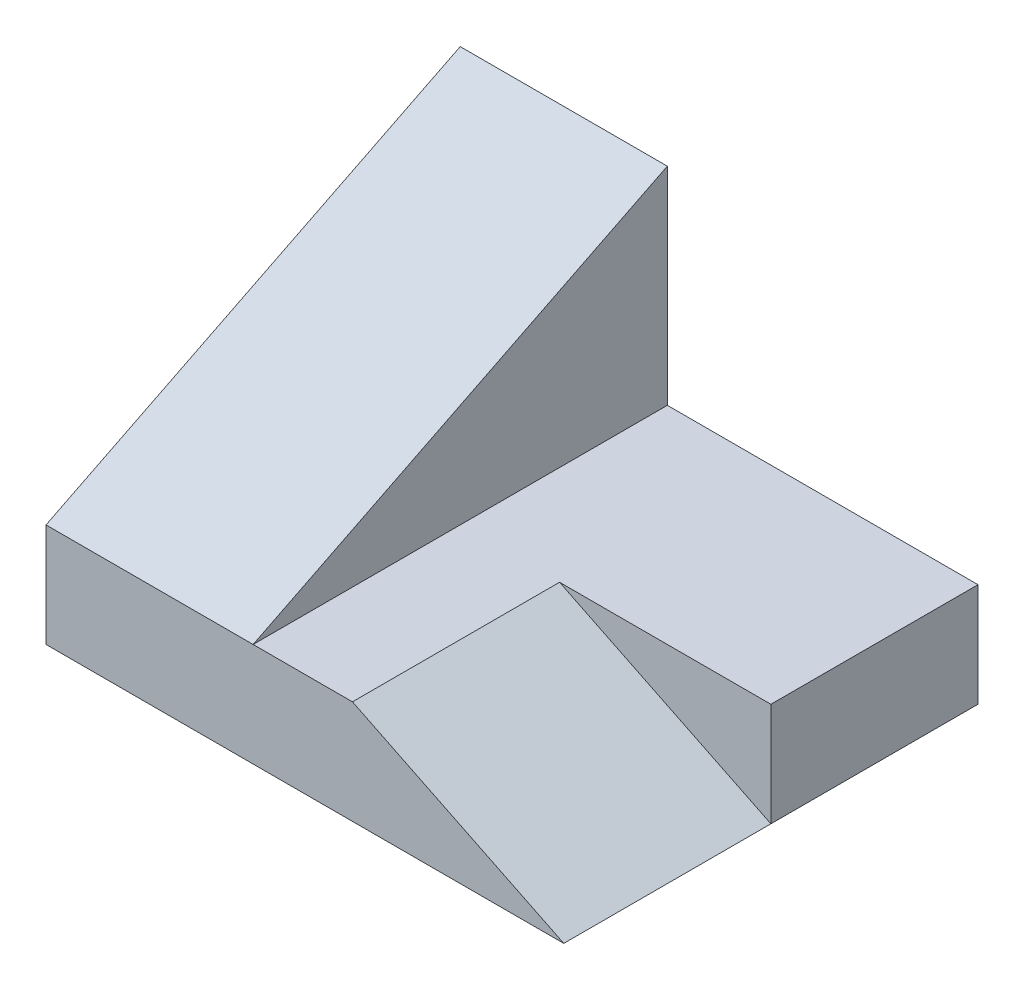
ISO-10303-21;
HEADER;
FILE_DESCRIPTION(('STEP AP214'),'2;1');
FILE_NAME('part.step','',(''),(''),'','','');
FILE_SCHEMA(('AUTOMOTIVE_DESIGN { 1 0 10303 214 1 1 1 1 }'));
ENDSEC;
DATA;
#1=APPLICATION_CONTEXT('core data for automotive mechanical design processes');
#2=APPLICATION_PROTOCOL_DEFINITION('international standard','automotive_design',2000,#1);
#3=PRODUCT_CONTEXT('',#1,'mechanical');
#4=PRODUCT('Part','Part','',(#3));
#5=PRODUCT_RELATED_PRODUCT_CATEGORY('part','',(#4));
#6=PRODUCT_DEFINITION_FORMATION('','',#4);
#7=PRODUCT_DEFINITION_CONTEXT('part definition',#1,'design');
#8=PRODUCT_DEFINITION('design','',#6,#7);
#9=PRODUCT_DEFINITION_SHAPE('','',#8);
#10=(LENGTH_UNIT() NAMED_UNIT(*) SI_UNIT(.MILLI.,.METRE.));
#11=(NAMED_UNIT(*) PLANE_ANGLE_UNIT() SI_UNIT($,.RADIAN.));
#12=(NAMED_UNIT(*) SI_UNIT($,.STERADIAN.) SOLID_ANGLE_UNIT());
#13=UNCERTAINTY_MEASURE_WITH_UNIT(LENGTH_MEASURE(1.E-05),#10,'distance_accuracy_value','');
#14=(GEOMETRIC_REPRESENTATION_CONTEXT(3) GLOBAL_UNCERTAINTY_ASSIGNED_CONTEXT((#13)) GLOBAL_UNIT_ASSIGNED_CONTEXT((#10,
#11,#12)) REPRESENTATION_CONTEXT('',''));
#15=CARTESIAN_POINT('',(0.,0.,0.));
#16=DIRECTION('',(0.,0.,1.));
#17=DIRECTION('',(1.,0.,0.));
#18=AXIS2_PLACEMENT_3D('',#15,#16,#17);
#19=CARTESIAN_POINT('',(0.,10.,0.));
#20=DIRECTION('',(0.,-1.,0.));
#21=DIRECTION('',(0.,0.,-1.));
#22=AXIS2_PLACEMENT_3D('',#19,#20,#21);
#23=PLANE('',#22);
#24=DIRECTION('',(0.,0.,-1.));
#25=VECTOR('',#24,1.);
#26=CARTESIAN_POINT('',(20.,10.,-40.));
#27=LINE('',#26,#25);
#28=CARTESIAN_POINT('',(20.,10.,0.));
#29=VERTEX_POINT('',#28);
#30=CARTESIAN_POINT('',(20.,10.,-40.));
#31=VERTEX_POINT('',#30);
#32=EDGE_CURVE('E164',#29,#31,#27,.T.);
#33=ORIENTED_EDGE('',*,*,#32,.F.);
#34=DIRECTION('',(1.,0.,0.));
#35=VECTOR('',#34,1.);
#36=CARTESIAN_POINT('',(0.,10.,0.));
#37=LINE('',#36,#35);
#38=CARTESIAN_POINT('',(29.5929197862648,10.,0.));
#39=VERTEX_POINT('',#38);
#40=EDGE_CURVE('E98',#29,#39,#37,.T.);
#41=ORIENTED_EDGE('',*,*,#40,.T.);
#42=DIRECTION('',(0.,0.,1.));
#43=VECTOR('',#42,1.);
#44=CARTESIAN_POINT('',(29.5929197862648,10.,-20.));
#45=LINE('',#44,#43);
#46=CARTESIAN_POINT('',(29.5929197862648,10.,-20.));
#47=VERTEX_POINT('',#46);
#48=EDGE_CURVE('E113',#47,#39,#45,.T.);
#49=ORIENTED_EDGE('',*,*,#48,.F.);
#50=DIRECTION('',(-1.,0.,0.));
#51=VECTOR('',#50,1.);
#52=CARTESIAN_POINT('',(50.,10.,-20.));
#53=LINE('',#52,#51);
#54=CARTESIAN_POINT('',(50.,10.,-20.));
#55=VERTEX_POINT('',#54);
#56=EDGE_CURVE('E133',#55,#47,#53,.T.);
#57=ORIENTED_EDGE('',*,*,#56,.F.);
#58=DIRECTION('',(0.,0.,-1.));
#59=VECTOR('',#58,1.);
#60=CARTESIAN_POINT('',(50.,10.,0.));
#61=LINE('',#60,#59);
#62=CARTESIAN_POINT('',(50.,10.,-40.));
#63=VERTEX_POINT('',#62);
#64=EDGE_CURVE('E55',#55,#63,#61,.T.);
#65=ORIENTED_EDGE('',*,*,#64,.T.);
#66=DIRECTION('',(-1.,0.,0.));
#67=VECTOR('',#66,1.);
#68=CARTESIAN_POINT('',(0.,10.,-40.));
#69=LINE('',#68,#67);
#70=EDGE_CURVE('E91',#63,#31,#69,.T.);
#71=ORIENTED_EDGE('',*,*,#70,.T.);
#72=EDGE_LOOP('',(#33,#41,#49,#57,#65,#71));
#73=FACE_BOUND('',#72,.T.);
#74=ADVANCED_FACE('F39',(#73),#23,.F.);
#75=CARTESIAN_POINT('',(50.,10.,0.));
#76=DIRECTION('',(-1.,0.,0.));
#77=DIRECTION('',(0.,0.,1.));
#78=AXIS2_PLACEMENT_3D('',#75,#76,#77);
#79=PLANE('',#78);
#80=DIRECTION('',(0.,1.,0.));
#81=VECTOR('',#80,1.);
#82=CARTESIAN_POINT('',(50.,0.,-20.));
#83=LINE('',#82,#81);
#84=CARTESIAN_POINT('',(50.,0.,-20.));
#85=VERTEX_POINT('',#84);
#86=EDGE_CURVE('E78',#85,#55,#83,.T.);
#87=ORIENTED_EDGE('',*,*,#86,.F.);
#88=DIRECTION('',(0.,0.,-1.));
#89=VECTOR('',#88,1.);
#90=CARTESIAN_POINT('',(50.,0.,0.));
#91=LINE('',#90,#89);
#92=CARTESIAN_POINT('',(50.,0.,-40.));
#93=VERTEX_POINT('',#92);
#94=EDGE_CURVE('E72',#85,#93,#91,.T.);
#95=ORIENTED_EDGE('',*,*,#94,.T.);
#96=DIRECTION('',(0.,-1.,0.));
#97=VECTOR('',#96,1.);
#98=CARTESIAN_POINT('',(50.,10.,-40.));
#99=LINE('',#98,#97);
#100=EDGE_CURVE('E48',#63,#93,#99,.T.);
#101=ORIENTED_EDGE('',*,*,#100,.F.);
#102=ORIENTED_EDGE('',*,*,#64,.F.);
#103=EDGE_LOOP('',(#87,#95,#101,#102));
#104=FACE_BOUND('',#103,.T.);
#105=ADVANCED_FACE('F74',(#104),#79,.F.);
#106=CARTESIAN_POINT('',(0.,10.,0.));
#107=DIRECTION('',(1.,0.,0.));
#108=DIRECTION('',(0.,0.,-1.));
#109=AXIS2_PLACEMENT_3D('',#106,#107,#108);
#110=PLANE('',#109);
#111=DIRECTION('',(0.,-1.,0.));
#112=VECTOR('',#111,1.);
#113=CARTESIAN_POINT('',(0.,10.,0.));
#114=LINE('',#113,#112);
#115=CARTESIAN_POINT('',(0.,10.,0.));
#116=VERTEX_POINT('',#115);
#117=CARTESIAN_POINT('',(0.,0.,0.));
#118=VERTEX_POINT('',#117);
#119=EDGE_CURVE('E11',#116,#118,#114,.T.);
#120=ORIENTED_EDGE('',*,*,#119,.F.);
#121=DIRECTION('',(0.,-0.447213595499958,0.894427190999916));
#122=VECTOR('',#121,1.);
#123=CARTESIAN_POINT('',(0.,10.,0.));
#124=LINE('',#123,#122);
#125=CARTESIAN_POINT('',(0.,30.,-40.));
#126=VERTEX_POINT('',#125);
#127=EDGE_CURVE('E163',#126,#116,#124,.T.);
#128=ORIENTED_EDGE('',*,*,#127,.F.);
#129=DIRECTION('',(0.,-1.,0.));
#130=VECTOR('',#129,1.);
#131=CARTESIAN_POINT('',(0.,10.,-40.));
#132=LINE('',#131,#130);
#133=CARTESIAN_POINT('',(0.,0.,-40.));
#134=VERTEX_POINT('',#133);
#135=EDGE_CURVE('E92',#126,#134,#132,.T.);
#136=ORIENTED_EDGE('',*,*,#135,.T.);
#137=DIRECTION('',(0.,0.,1.));
#138=VECTOR('',#137,1.);
#139=CARTESIAN_POINT('',(0.,0.,0.));
#140=LINE('',#139,#138);
#141=EDGE_CURVE('E97',#134,#118,#140,.T.);
#142=ORIENTED_EDGE('',*,*,#141,.T.);
#143=EDGE_LOOP('',(#120,#128,#136,#142));
#144=FACE_BOUND('',#143,.T.);
#145=ADVANCED_FACE('F41',(#144),#110,.F.);
#146=CARTESIAN_POINT('',(0.,10.,0.));
#147=DIRECTION('',(0.,0.,-1.));
#148=DIRECTION('',(-1.,0.,0.));
#149=AXIS2_PLACEMENT_3D('',#146,#147,#148);
#150=PLANE('',#149);
#151=ORIENTED_EDGE('',*,*,#40,.F.);
#152=DIRECTION('',(-1.,0.,0.));
#153=VECTOR('',#152,1.);
#154=CARTESIAN_POINT('',(20.,10.,0.));
#155=LINE('',#154,#153);
#156=EDGE_CURVE('E158',#29,#116,#155,.T.);
#157=ORIENTED_EDGE('',*,*,#156,.T.);
#158=ORIENTED_EDGE('',*,*,#119,.T.);
#159=DIRECTION('',(1.,0.,0.));
#160=VECTOR('',#159,1.);
#161=CARTESIAN_POINT('',(0.,0.,0.));
#162=LINE('',#161,#160);
#163=CARTESIAN_POINT('',(50.,0.,0.));
#164=VERTEX_POINT('',#163);
#165=EDGE_CURVE('E83',#118,#164,#162,.T.);
#166=ORIENTED_EDGE('',*,*,#165,.T.);
#167=DIRECTION('',(0.897981074159523,-0.440034078738579,0.));
#168=VECTOR('',#167,1.);
#169=CARTESIAN_POINT('',(29.5929197862648,10.,0.));
#170=LINE('',#169,#168);
#171=EDGE_CURVE('E119',#39,#164,#170,.T.);
#172=ORIENTED_EDGE('',*,*,#171,.F.);
#173=EDGE_LOOP('',(#151,#157,#158,#166,#172));
#174=FACE_BOUND('',#173,.T.);
#175=ADVANCED_FACE('F118',(#174),#150,.F.);
#176=CARTESIAN_POINT('',(0.,10.,-40.));
#177=DIRECTION('',(0.,0.,1.));
#178=DIRECTION('',(1.,0.,0.));
#179=AXIS2_PLACEMENT_3D('',#176,#177,#178);
#180=PLANE('',#179);
#181=DIRECTION('',(-1.,0.,0.));
#182=VECTOR('',#181,1.);
#183=CARTESIAN_POINT('',(0.,0.,-40.));
#184=LINE('',#183,#182);
#185=EDGE_CURVE('E88',#93,#134,#184,.T.);
#186=ORIENTED_EDGE('',*,*,#185,.T.);
#187=ORIENTED_EDGE('',*,*,#135,.F.);
#188=DIRECTION('',(-1.,0.,0.));
#189=VECTOR('',#188,1.);
#190=CARTESIAN_POINT('',(0.,30.,-40.));
#191=LINE('',#190,#189);
#192=CARTESIAN_POINT('',(20.,30.,-40.));
#193=VERTEX_POINT('',#192);
#194=EDGE_CURVE('E170',#193,#126,#191,.T.);
#195=ORIENTED_EDGE('',*,*,#194,.F.);
#196=DIRECTION('',(0.,-1.,0.));
#197=VECTOR('',#196,1.);
#198=CARTESIAN_POINT('',(20.,30.,-40.));
#199=LINE('',#198,#197);
#200=EDGE_CURVE('E137',#193,#31,#199,.T.);
#201=ORIENTED_EDGE('',*,*,#200,.T.);
#202=ORIENTED_EDGE('',*,*,#70,.F.);
#203=ORIENTED_EDGE('',*,*,#100,.T.);
#204=EDGE_LOOP('',(#186,#187,#195,#201,#202,#203));
#205=FACE_BOUND('',#204,.T.);
#206=ADVANCED_FACE('F86',(#205),#180,.F.);
#207=CARTESIAN_POINT('',(0.,0.,0.));
#208=DIRECTION('',(0.,-1.,0.));
#209=DIRECTION('',(0.,0.,-1.));
#210=AXIS2_PLACEMENT_3D('',#207,#208,#209);
#211=PLANE('',#210);
#212=ORIENTED_EDGE('',*,*,#141,.F.);
#213=ORIENTED_EDGE('',*,*,#185,.F.);
#214=ORIENTED_EDGE('',*,*,#94,.F.);
#215=EDGE_CURVE('E82',#164,#85,#91,.T.);
#216=ORIENTED_EDGE('',*,*,#215,.F.);
#217=ORIENTED_EDGE('',*,*,#165,.F.);
#218=EDGE_LOOP('',(#212,#213,#214,#216,#217));
#219=FACE_BOUND('',#218,.T.);
#220=ADVANCED_FACE('F94',(#219),#211,.T.);
#221=CARTESIAN_POINT('',(29.5929197862648,10.,-20.));
#222=DIRECTION('',(-0.440034078738579,-0.897981074159523,0.));
#223=DIRECTION('',(0.897981074159523,-0.440034078738579,0.));
#224=AXIS2_PLACEMENT_3D('',#221,#222,#223);
#225=PLANE('',#224);
#226=ORIENTED_EDGE('',*,*,#171,.T.);
#227=ORIENTED_EDGE('',*,*,#215,.T.);
#228=DIRECTION('',(0.897981074159523,-0.440034078738579,0.));
#229=VECTOR('',#228,1.);
#230=CARTESIAN_POINT('',(29.5929197862648,10.,-20.));
#231=LINE('',#230,#229);
#232=EDGE_CURVE('E127',#47,#85,#231,.T.);
#233=ORIENTED_EDGE('',*,*,#232,.F.);
#234=ORIENTED_EDGE('',*,*,#48,.T.);
#235=EDGE_LOOP('',(#226,#227,#233,#234));
#236=FACE_BOUND('',#235,.T.);
#237=ADVANCED_FACE('F125',(#236),#225,.F.);
#238=CARTESIAN_POINT('',(0.,0.,-20.));
#239=DIRECTION('',(0.,0.,1.));
#240=DIRECTION('',(1.,0.,0.));
#241=AXIS2_PLACEMENT_3D('',#238,#239,#240);
#242=PLANE('',#241);
#243=ORIENTED_EDGE('',*,*,#232,.T.);
#244=ORIENTED_EDGE('',*,*,#86,.T.);
#245=ORIENTED_EDGE('',*,*,#56,.T.);
#246=EDGE_LOOP('',(#243,#244,#245));
#247=FACE_BOUND('',#246,.T.);
#248=ADVANCED_FACE('F132',(#247),#242,.T.);
#249=CARTESIAN_POINT('',(20.,30.,-40.));
#250=DIRECTION('',(-1.,0.,0.));
#251=DIRECTION('',(0.,0.,1.));
#252=AXIS2_PLACEMENT_3D('',#249,#250,#251);
#253=PLANE('',#252);
#254=ORIENTED_EDGE('',*,*,#200,.F.);
#255=DIRECTION('',(0.,-0.447213595499958,0.894427190999916));
#256=VECTOR('',#255,1.);
#257=CARTESIAN_POINT('',(20.,10.,0.));
#258=LINE('',#257,#256);
#259=EDGE_CURVE('E161',#193,#29,#258,.T.);
#260=ORIENTED_EDGE('',*,*,#259,.T.);
#261=ORIENTED_EDGE('',*,*,#32,.T.);
#262=EDGE_LOOP('',(#254,#260,#261));
#263=FACE_BOUND('',#262,.T.);
#264=ADVANCED_FACE('F167',(#263),#253,.F.);
#265=CARTESIAN_POINT('',(20.,10.,0.));
#266=DIRECTION('',(0.,-0.894427190999916,-0.447213595499958));
#267=DIRECTION('',(0.,0.447213595499958,-0.894427190999916));
#268=AXIS2_PLACEMENT_3D('',#265,#266,#267);
#269=PLANE('',#268);
#270=ORIENTED_EDGE('',*,*,#127,.T.);
#271=ORIENTED_EDGE('',*,*,#156,.F.);
#272=ORIENTED_EDGE('',*,*,#259,.F.);
#273=ORIENTED_EDGE('',*,*,#194,.T.);
#274=EDGE_LOOP('',(#270,#271,#272,#273));
#275=FACE_BOUND('',#274,.T.);
#276=ADVANCED_FACE('F160',(#275),#269,.F.);
#277=CLOSED_SHELL('',(#74,#105,#145,#175,#206,#220,#237,#248,#264,#276));
#278=MANIFOLD_SOLID_BREP('B2',#277);
#279=ADVANCED_BREP_SHAPE_REPRESENTATION('',(#18,#278),#14);
#280=SHAPE_DEFINITION_REPRESENTATION(#9,#279);
ENDSEC;
END-ISO-10303-21;
